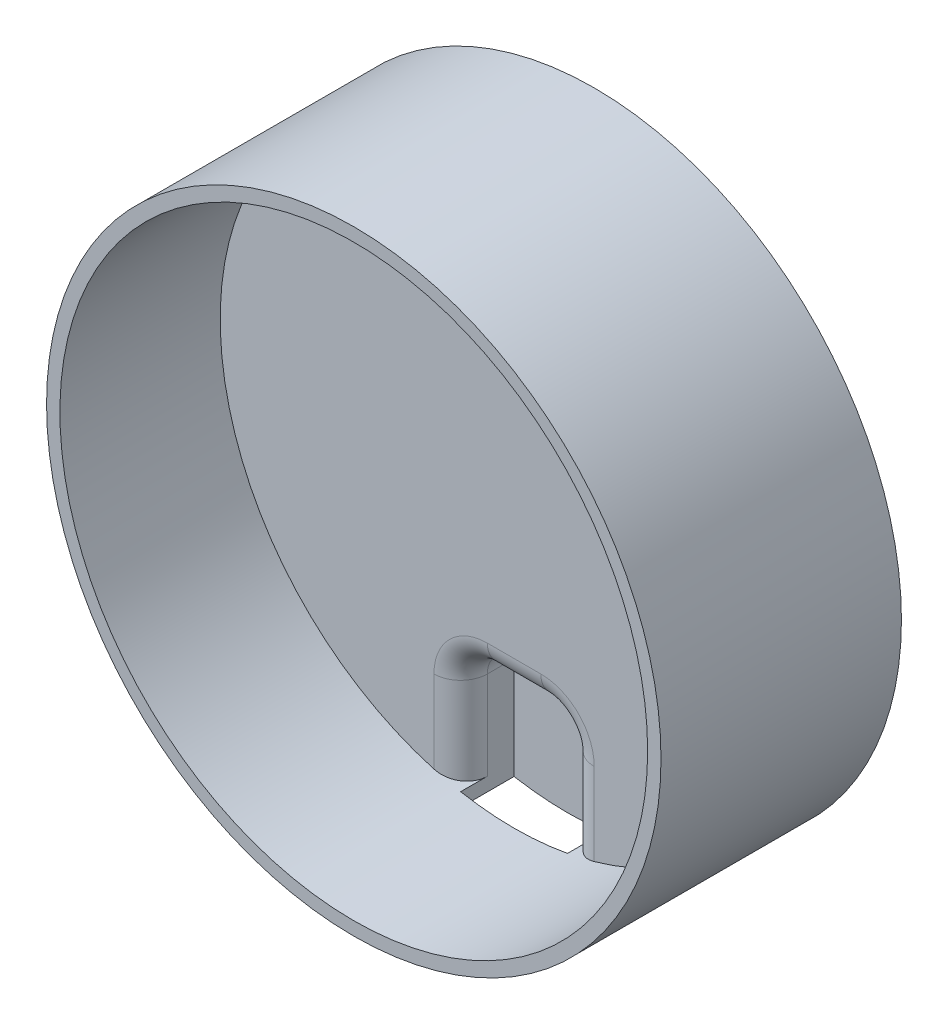
ISO-10303-21;
HEADER;
FILE_DESCRIPTION(('STEP AP214'),'2;1');
FILE_NAME('part.step','',(''),(''),'','','');
FILE_SCHEMA(('AUTOMOTIVE_DESIGN { 1 0 10303 214 1 1 1 1 }'));
ENDSEC;
DATA;
#1=APPLICATION_CONTEXT('core data for automotive mechanical design processes');
#2=APPLICATION_PROTOCOL_DEFINITION('international standard','automotive_design',2000,#1);
#3=PRODUCT_CONTEXT('',#1,'mechanical');
#4=PRODUCT('Part','Part','',(#3));
#5=PRODUCT_RELATED_PRODUCT_CATEGORY('part','',(#4));
#6=PRODUCT_DEFINITION_FORMATION('','',#4);
#7=PRODUCT_DEFINITION_CONTEXT('part definition',#1,'design');
#8=PRODUCT_DEFINITION('design','',#6,#7);
#9=PRODUCT_DEFINITION_SHAPE('','',#8);
#10=(LENGTH_UNIT() NAMED_UNIT(*) SI_UNIT(.MILLI.,.METRE.));
#11=(NAMED_UNIT(*) PLANE_ANGLE_UNIT() SI_UNIT($,.RADIAN.));
#12=(NAMED_UNIT(*) SI_UNIT($,.STERADIAN.) SOLID_ANGLE_UNIT());
#13=UNCERTAINTY_MEASURE_WITH_UNIT(LENGTH_MEASURE(1.E-05),#10,'distance_accuracy_value','');
#14=(GEOMETRIC_REPRESENTATION_CONTEXT(3) GLOBAL_UNCERTAINTY_ASSIGNED_CONTEXT((#13)) GLOBAL_UNIT_ASSIGNED_CONTEXT((#10,
#11,#12)) REPRESENTATION_CONTEXT('',''));
#15=CARTESIAN_POINT('',(0.,0.,0.));
#16=DIRECTION('',(0.,0.,1.));
#17=DIRECTION('',(1.,0.,0.));
#18=AXIS2_PLACEMENT_3D('',#15,#16,#17);
#19=CARTESIAN_POINT('',(-5.18423182009248,10.7360109289618,0.));
#20=DIRECTION('',(0.,0.,-1.));
#21=DIRECTION('',(-1.,0.,0.));
#22=AXIS2_PLACEMENT_3D('',#19,#20,#21);
#23=PLANE('',#22);
#24=CARTESIAN_POINT('',(-4.18423182009248,3.23601092896175,0.));
#25=DIRECTION('',(0.,0.,-1.));
#26=DIRECTION('',(-1.,0.,0.));
#27=AXIS2_PLACEMENT_3D('',#24,#25,#26);
#28=CIRCLE('',#27,2.);
#29=CARTESIAN_POINT('',(-2.18423182009248,3.23601092896176,0.));
#30=VERTEX_POINT('',#29);
#31=CARTESIAN_POINT('',(-4.18423182009248,5.23601092896175,0.));
#32=VERTEX_POINT('',#31);
#33=EDGE_CURVE('E194',#30,#32,#28,.F.);
#34=ORIENTED_EDGE('',*,*,#33,.F.);
#35=DIRECTION('',(0.,1.,0.));
#36=VECTOR('',#35,1.);
#37=CARTESIAN_POINT('',(-2.18423182009249,10.7360109289618,0.));
#38=LINE('',#37,#36);
#39=CARTESIAN_POINT('',(-2.18423182009248,0.153005684703396,0.));
#40=VERTEX_POINT('',#39);
#41=EDGE_CURVE('E208',#30,#40,#38,.F.);
#42=ORIENTED_EDGE('',*,*,#41,.T.);
#43=CARTESIAN_POINT('',(-5.18423182009248,10.7360109289618,0.));
#44=DIRECTION('',(0.,0.,1.));
#45=DIRECTION('',(1.,0.,0.));
#46=AXIS2_PLACEMENT_3D('',#43,#44,#45);
#47=CIRCLE('',#46,11.);
#48=CARTESIAN_POINT('',(-8.18423182009248,0.153005684703398,0.));
#49=VERTEX_POINT('',#48);
#50=EDGE_CURVE('E158',#40,#49,#47,.T.);
#51=ORIENTED_EDGE('',*,*,#50,.T.);
#52=DIRECTION('',(0.,-1.,0.));
#53=VECTOR('',#52,1.);
#54=CARTESIAN_POINT('',(-8.18423182009248,10.7360109289618,0.));
#55=LINE('',#54,#53);
#56=CARTESIAN_POINT('',(-8.18423182009248,3.23601092896175,0.));
#57=VERTEX_POINT('',#56);
#58=EDGE_CURVE('E205',#49,#57,#55,.F.);
#59=ORIENTED_EDGE('',*,*,#58,.T.);
#60=CARTESIAN_POINT('',(-6.18423182009248,3.23601092896175,0.));
#61=DIRECTION('',(0.,0.,-1.));
#62=DIRECTION('',(-1.,0.,0.));
#63=AXIS2_PLACEMENT_3D('',#60,#61,#62);
#64=CIRCLE('',#63,2.);
#65=CARTESIAN_POINT('',(-6.18423182009248,5.23601092896175,0.));
#66=VERTEX_POINT('',#65);
#67=EDGE_CURVE('E201',#66,#57,#64,.F.);
#68=ORIENTED_EDGE('',*,*,#67,.F.);
#69=DIRECTION('',(-1.,0.,0.));
#70=VECTOR('',#69,1.);
#71=CARTESIAN_POINT('',(-5.18423182009248,5.23601092896175,0.));
#72=LINE('',#71,#70);
#73=EDGE_CURVE('E198',#66,#32,#72,.F.);
#74=ORIENTED_EDGE('',*,*,#73,.T.);
#75=EDGE_LOOP('',(#34,#42,#51,#59,#68,#74));
#76=FACE_BOUND('',#75,.T.);
#77=ADVANCED_FACE('F47',(#76),#23,.F.);
#78=CARTESIAN_POINT('',(-5.18423182009248,10.7360109289618,6.));
#79=DIRECTION('',(0.,0.,1.));
#80=DIRECTION('',(1.,0.,0.));
#81=AXIS2_PLACEMENT_3D('',#78,#79,#80);
#82=PLANE('',#81);
#83=CARTESIAN_POINT('',(-5.18423182009248,10.7360109289618,6.));
#84=DIRECTION('',(0.,0.,1.));
#85=DIRECTION('',(1.,0.,0.));
#86=AXIS2_PLACEMENT_3D('',#83,#84,#85);
#87=CIRCLE('',#86,11.5);
#88=CARTESIAN_POINT('',(6.31576817990752,10.7360109289618,6.));
#89=VERTEX_POINT('',#88);
#90=EDGE_CURVE('E163',#89,#89,#87,.T.);
#91=ORIENTED_EDGE('',*,*,#90,.T.);
#92=EDGE_LOOP('',(#91));
#93=FACE_BOUND('',#92,.T.);
#94=CARTESIAN_POINT('',(-5.18423182009248,10.7360109289618,6.));
#95=DIRECTION('',(0.,0.,1.));
#96=DIRECTION('',(1.,0.,0.));
#97=AXIS2_PLACEMENT_3D('',#94,#95,#96);
#98=CIRCLE('',#97,11.);
#99=CARTESIAN_POINT('',(5.81576817990752,10.7360109289618,6.));
#100=VERTEX_POINT('',#99);
#101=EDGE_CURVE('E157',#100,#100,#98,.T.);
#102=ORIENTED_EDGE('',*,*,#101,.F.);
#103=EDGE_LOOP('',(#102));
#104=FACE_BOUND('',#103,.T.);
#105=ADVANCED_FACE('F253',(#93,#104),#82,.T.);
#106=CARTESIAN_POINT('',(-5.18423182009248,10.7360109289618,6.));
#107=DIRECTION('',(0.,0.,-1.));
#108=DIRECTION('',(-1.,0.,0.));
#109=AXIS2_PLACEMENT_3D('',#106,#107,#108);
#110=CYLINDRICAL_SURFACE('',#109,11.5);
#111=DIRECTION('',(0.,0.,-1.));
#112=VECTOR('',#111,1.);
#113=CARTESIAN_POINT('',(-3.18423182009248,-0.588740723944367,6.));
#114=LINE('',#113,#112);
#115=CARTESIAN_POINT('',(-3.18423182009248,-0.588740723944367,0.));
#116=VERTEX_POINT('',#115);
#117=CARTESIAN_POINT('',(-3.18423182009248,-0.588740723944367,-2.));
#118=VERTEX_POINT('',#117);
#119=EDGE_CURVE('E174',#116,#118,#114,.T.);
#120=ORIENTED_EDGE('',*,*,#119,.T.);
#121=CARTESIAN_POINT('',(-5.18423182009248,10.7360109289618,-2.));
#122=DIRECTION('',(0.,0.,-1.));
#123=DIRECTION('',(-1.,0.,0.));
#124=AXIS2_PLACEMENT_3D('',#121,#122,#123);
#125=CIRCLE('',#124,11.5);
#126=CARTESIAN_POINT('',(-7.18423182009248,-0.588740723944369,-2.));
#127=VERTEX_POINT('',#126);
#128=EDGE_CURVE('E181',#118,#127,#125,.T.);
#129=ORIENTED_EDGE('',*,*,#128,.T.);
#130=DIRECTION('',(0.,0.,-1.));
#131=VECTOR('',#130,1.);
#132=CARTESIAN_POINT('',(-7.18423182009248,-0.588740723944369,6.));
#133=LINE('',#132,#131);
#134=CARTESIAN_POINT('',(-7.18423182009248,-0.588740723944369,0.));
#135=VERTEX_POINT('',#134);
#136=EDGE_CURVE('E178',#127,#135,#133,.F.);
#137=ORIENTED_EDGE('',*,*,#136,.T.);
#138=CARTESIAN_POINT('',(-5.18423182009248,10.7360109289618,0.));
#139=DIRECTION('',(0.,0.,-1.));
#140=DIRECTION('',(-1.,0.,0.));
#141=AXIS2_PLACEMENT_3D('',#138,#139,#140);
#142=CIRCLE('',#141,11.5);
#143=EDGE_CURVE('E151',#116,#135,#142,.T.);
#144=ORIENTED_EDGE('',*,*,#143,.F.);
#145=EDGE_LOOP('',(#120,#129,#137,#144));
#146=FACE_BOUND('',#145,.T.);
#147=ORIENTED_EDGE('',*,*,#90,.F.);
#148=EDGE_LOOP('',(#147));
#149=FACE_BOUND('',#148,.T.);
#150=CARTESIAN_POINT('',(-5.18423182009248,10.7360109289618,-3.));
#151=DIRECTION('',(0.,0.,-1.));
#152=DIRECTION('',(-1.,0.,0.));
#153=AXIS2_PLACEMENT_3D('',#150,#151,#152);
#154=CIRCLE('',#153,11.5);
#155=CARTESIAN_POINT('',(-16.6842318200925,10.7360109289618,-3.));
#156=VERTEX_POINT('',#155);
#157=EDGE_CURVE('E166',#156,#156,#154,.T.);
#158=ORIENTED_EDGE('',*,*,#157,.F.);
#159=EDGE_LOOP('',(#158));
#160=FACE_BOUND('',#159,.T.);
#161=ADVANCED_FACE('F250',(#146,#149,#160),#110,.T.);
#162=CARTESIAN_POINT('',(-5.18423182009248,10.7360109289618,6.));
#163=DIRECTION('',(0.,0.,-1.));
#164=DIRECTION('',(-1.,0.,0.));
#165=AXIS2_PLACEMENT_3D('',#162,#163,#164);
#166=CYLINDRICAL_SURFACE('',#165,11.);
#167=ORIENTED_EDGE('',*,*,#101,.T.);
#168=EDGE_LOOP('',(#167));
#169=FACE_BOUND('',#168,.T.);
#170=CARTESIAN_POINT('',(-7.18423182009248,-0.0806428974302088,0.));
#171=VERTEX_POINT('',#170);
#172=CARTESIAN_POINT('',(-3.18423182009248,-0.0806428974302071,0.));
#173=VERTEX_POINT('',#172);
#174=EDGE_CURVE('E150',#171,#173,#47,.T.);
#175=ORIENTED_EDGE('',*,*,#174,.F.);
#176=DIRECTION('',(0.,0.,-1.));
#177=VECTOR('',#176,1.);
#178=CARTESIAN_POINT('',(-7.18423182009248,-0.0806428974302088,-1.));
#179=LINE('',#178,#177);
#180=CARTESIAN_POINT('',(-7.18423182009248,-0.0806428974302088,-1.));
#181=VERTEX_POINT('',#180);
#182=EDGE_CURVE('E134',#181,#171,#179,.F.);
#183=ORIENTED_EDGE('',*,*,#182,.F.);
#184=CARTESIAN_POINT('',(-7.18423182009248,-0.0806428974302088,-1.));
#185=CARTESIAN_POINT('',(-7.18423177463327,-0.0806422869424325,-0.972258752276593));
#186=CARTESIAN_POINT('',(-7.18538693667628,-0.0804293852593474,-0.944530858273163));
#187=CARTESIAN_POINT('',(-7.18999378875954,-0.0795762964044474,-0.8892749936896));
#188=CARTESIAN_POINT('',(-7.19344532728222,-0.0789361374235505,-0.861747010040287));
#189=CARTESIAN_POINT('',(-7.2072058701618,-0.0763740373864095,-0.77982460726582));
#190=CARTESIAN_POINT('',(-7.22092092773206,-0.0738104888622706,-0.72598143951789));
#191=CARTESIAN_POINT('',(-7.25701398947779,-0.0669473407041112,-0.621407534284094));
#192=CARTESIAN_POINT('',(-7.27939541061562,-0.0626470562833616,-0.570678033602038));
#193=CARTESIAN_POINT('',(-7.33212107287745,-0.0522832244348989,-0.47374010754615));
#194=CARTESIAN_POINT('',(-7.36246452548832,-0.0462198516067456,-0.427531235097446));
#195=CARTESIAN_POINT('',(-7.43033411692443,-0.0322863531029595,-0.340689609155465));
#196=CARTESIAN_POINT('',(-7.46789336142271,-0.0244078652313488,-0.300084099281275));
#197=CARTESIAN_POINT('',(-7.54895107837842,-0.00688527572085646,-0.225763419727203));
#198=CARTESIAN_POINT('',(-7.59245037967602,0.00275907237976829,-0.192049213260847));
#199=CARTESIAN_POINT('',(-7.68479494044306,0.0238935217597276,-0.131871037441532));
#200=CARTESIAN_POINT('',(-7.73371279402689,0.0354099857782793,-0.105527925513152));
#201=CARTESIAN_POINT('',(-7.8348921488052,0.0600234998016867,-0.0613801333439638));
#202=CARTESIAN_POINT('',(-7.88715355326666,0.0731205040892793,-0.0435752062094819));
#203=CARTESIAN_POINT('',(-7.98036500036044,0.0972446154346724,-0.0201303206303154));
#204=CARTESIAN_POINT('',(-8.0209202320516,0.10798386058537,-0.0125718057498728));
#205=CARTESIAN_POINT('',(-8.10241539239132,0.130068788386396,-0.00250697420107241));
#206=CARTESIAN_POINT('',(-8.1433545455798,0.141413403804901,7.95041071891822E-06));
#207=CARTESIAN_POINT('',(-8.18423182009248,0.153005684703397,0.));
#208=B_SPLINE_CURVE_WITH_KNOTS('',3,(#184,#185,#186,#187,#188,#189,#190,#191,#192,#193,#194,
#195,#196,#197,#198,#199,#200,#201,#202,#203,#204,#205,#206,#207),.UNSPECIFIED.,.F.,.F.,(4,2,2,
2,2,2,2,2,2,2,2,4),(0.,0.0831723927392125,0.166339298212691,0.332346450219146,0.498419122063063,
0.664475353242006,0.831312466044673,0.998172882137291,1.16762725501374,1.33707672758215,
1.46466866118571,1.59204264646731),.UNSPECIFIED.);
#209=EDGE_CURVE('E11',#181,#49,#208,.T.);
#210=ORIENTED_EDGE('',*,*,#209,.T.);
#211=ORIENTED_EDGE('',*,*,#50,.F.);
#212=CARTESIAN_POINT('',(-2.18423182009248,0.153005684703396,0.));
#213=CARTESIAN_POINT('',(-2.24100915306646,0.136891603268559,4.64075337397574E-05));
#214=CARTESIAN_POINT('',(-2.29794157643043,0.121265182873462,-0.00483417522478266));
#215=CARTESIAN_POINT('',(-2.41051093546785,0.0913052728027132,-0.0242757859651074));
#216=CARTESIAN_POINT('',(-2.46614712584722,0.0769725139649434,-0.0388422474654044));
#217=CARTESIAN_POINT('',(-2.57452176083388,0.0499186779136462,-0.077507008397882));
#218=CARTESIAN_POINT('',(-2.62725631924261,0.03719973371355,-0.101617752927257));
#219=CARTESIAN_POINT('',(-2.72804092862509,0.0136138773871811,-0.158796251475863));
#220=CARTESIAN_POINT('',(-2.77609412297181,0.00274571880341924,-0.191857938088128));
#221=CARTESIAN_POINT('',(-2.86484721431181,-0.0167782638590716,-0.265157123398469));
#222=CARTESIAN_POINT('',(-2.90569905623021,-0.0254819793470631,-0.305197853564687));
#223=CARTESIAN_POINT('',(-2.98013642451633,-0.0409744001956611,-0.391888988557135));
#224=CARTESIAN_POINT('',(-3.0137204979806,-0.0477627227313061,-0.43854071191156));
#225=CARTESIAN_POINT('',(-3.07177390268943,-0.0592833982455896,-0.535882781689624));
#226=CARTESIAN_POINT('',(-3.09644378761648,-0.0640614483175411,-0.586448370533961));
#227=CARTESIAN_POINT('',(-3.13697728950263,-0.0718185598383866,-0.691101791991747));
#228=CARTESIAN_POINT('',(-3.15284833329827,-0.0747991386657057,-0.745186610905423));
#229=CARTESIAN_POINT('',(-3.17077355747127,-0.0781478740798068,-0.833075281497483));
#230=CARTESIAN_POINT('',(-3.17581794223419,-0.0790846838452515,-0.866277340997182));
#231=CARTESIAN_POINT('',(-3.18254591004588,-0.080331222980995,-0.932981166717575));
#232=CARTESIAN_POINT('',(-3.18423455450417,-0.0806418967522687,-0.966482404904168));
#233=CARTESIAN_POINT('',(-3.18423182009248,-0.080642897430209,-1.));
#234=B_SPLINE_CURVE_WITH_KNOTS('',3,(#212,#213,#214,#215,#216,#217,#218,#219,#220,#221,#222,
#223,#224,#225,#226,#227,#228,#229,#230,#231,#232,#233),.UNSPECIFIED.,.F.,.F.,(4,2,2,2,2,2,2,2,
2,2,4),(0.,0.176881073997834,0.353861457344681,0.531073375296356,0.708165469397476,
0.880896351614881,1.0536617327213,1.2222543768895,1.39070449958403,1.49133315323502,
1.59180991474817),.UNSPECIFIED.);
#235=CARTESIAN_POINT('',(-3.18423182009248,-0.0806428974302089,-1.));
#236=VERTEX_POINT('',#235);
#237=EDGE_CURVE('E57',#40,#236,#234,.T.);
#238=ORIENTED_EDGE('',*,*,#237,.T.);
#239=DIRECTION('',(0.,0.,-1.));
#240=VECTOR('',#239,1.);
#241=CARTESIAN_POINT('',(-3.18423182009248,-0.0806428974302071,0.));
#242=LINE('',#241,#240);
#243=EDGE_CURVE('E65',#173,#236,#242,.T.);
#244=ORIENTED_EDGE('',*,*,#243,.F.);
#245=EDGE_LOOP('',(#175,#183,#210,#211,#238,#244));
#246=FACE_BOUND('',#245,.T.);
#247=ADVANCED_FACE('F155',(#169,#246),#166,.F.);
#248=CARTESIAN_POINT('',(-5.18423182009248,10.7360109289618,-3.));
#249=DIRECTION('',(0.,0.,-1.));
#250=DIRECTION('',(-1.,0.,0.));
#251=AXIS2_PLACEMENT_3D('',#248,#249,#250);
#252=PLANE('',#251);
#253=ORIENTED_EDGE('',*,*,#157,.T.);
#254=EDGE_LOOP('',(#253));
#255=FACE_BOUND('',#254,.T.);
#256=ADVANCED_FACE('F249',(#255),#252,.T.);
#257=CARTESIAN_POINT('',(-7.18423182009248,-0.763989071038246,-2.));
#258=DIRECTION('',(-1.,0.,0.));
#259=DIRECTION('',(0.,0.,1.));
#260=AXIS2_PLACEMENT_3D('',#257,#258,#259);
#261=PLANE('',#260);
#262=DIRECTION('',(0.,-1.,0.));
#263=VECTOR('',#262,1.);
#264=CARTESIAN_POINT('',(-7.18423182009248,-0.763989071038246,-1.));
#265=LINE('',#264,#263);
#266=CARTESIAN_POINT('',(-7.18423182009248,3.23601092896175,-1.));
#267=VERTEX_POINT('',#266);
#268=EDGE_CURVE('E141',#267,#181,#265,.T.);
#269=ORIENTED_EDGE('',*,*,#268,.T.);
#270=ORIENTED_EDGE('',*,*,#182,.T.);
#271=DIRECTION('',(0.,-1.,0.));
#272=VECTOR('',#271,1.);
#273=CARTESIAN_POINT('',(-7.18423182009248,-0.763989071038246,0.));
#274=LINE('',#273,#272);
#275=EDGE_CURVE('E138',#171,#135,#274,.T.);
#276=ORIENTED_EDGE('',*,*,#275,.T.);
#277=ORIENTED_EDGE('',*,*,#136,.F.);
#278=DIRECTION('',(0.,-1.,0.));
#279=VECTOR('',#278,1.);
#280=CARTESIAN_POINT('',(-7.18423182009248,-0.763989071038246,-2.));
#281=LINE('',#280,#279);
#282=CARTESIAN_POINT('',(-7.18423182009248,3.23601092896175,-2.));
#283=VERTEX_POINT('',#282);
#284=EDGE_CURVE('E318',#283,#127,#281,.T.);
#285=ORIENTED_EDGE('',*,*,#284,.F.);
#286=DIRECTION('',(0.,0.,1.));
#287=VECTOR('',#286,1.);
#288=CARTESIAN_POINT('',(-7.18423182009248,3.23601092896175,0.));
#289=LINE('',#288,#287);
#290=EDGE_CURVE('E211',#283,#267,#289,.T.);
#291=ORIENTED_EDGE('',*,*,#290,.T.);
#292=EDGE_LOOP('',(#269,#270,#276,#277,#285,#291));
#293=FACE_BOUND('',#292,.T.);
#294=ADVANCED_FACE('F136',(#293),#261,.F.);
#295=CARTESIAN_POINT('',(-3.18423182009248,4.23601092896175,-2.));
#296=DIRECTION('',(1.,0.,0.));
#297=DIRECTION('',(0.,1.,0.));
#298=AXIS2_PLACEMENT_3D('',#295,#296,#297);
#299=PLANE('',#298);
#300=DIRECTION('',(0.,1.,0.));
#301=VECTOR('',#300,1.);
#302=CARTESIAN_POINT('',(-3.18423182009248,4.23601092896175,0.));
#303=LINE('',#302,#301);
#304=EDGE_CURVE('E153',#116,#173,#303,.T.);
#305=ORIENTED_EDGE('',*,*,#304,.T.);
#306=ORIENTED_EDGE('',*,*,#243,.T.);
#307=DIRECTION('',(0.,1.,0.));
#308=VECTOR('',#307,1.);
#309=CARTESIAN_POINT('',(-3.18423182009248,4.23601092896175,-1.));
#310=LINE('',#309,#308);
#311=CARTESIAN_POINT('',(-3.18423182009248,3.23601092896176,-1.));
#312=VERTEX_POINT('',#311);
#313=EDGE_CURVE('E188',#236,#312,#310,.T.);
#314=ORIENTED_EDGE('',*,*,#313,.T.);
#315=DIRECTION('',(0.,0.,1.));
#316=VECTOR('',#315,1.);
#317=CARTESIAN_POINT('',(-3.18423182009248,3.23601092896176,-2.));
#318=LINE('',#317,#316);
#319=CARTESIAN_POINT('',(-3.18423182009248,3.23601092896176,-2.));
#320=VERTEX_POINT('',#319);
#321=EDGE_CURVE('E185',#312,#320,#318,.F.);
#322=ORIENTED_EDGE('',*,*,#321,.T.);
#323=DIRECTION('',(0.,1.,0.));
#324=VECTOR('',#323,1.);
#325=CARTESIAN_POINT('',(-3.18423182009248,4.23601092896175,-2.));
#326=LINE('',#325,#324);
#327=EDGE_CURVE('E321',#118,#320,#326,.T.);
#328=ORIENTED_EDGE('',*,*,#327,.F.);
#329=ORIENTED_EDGE('',*,*,#119,.F.);
#330=EDGE_LOOP('',(#305,#306,#314,#322,#328,#329));
#331=FACE_BOUND('',#330,.T.);
#332=ADVANCED_FACE('F315',(#331),#299,.F.);
#333=CARTESIAN_POINT('',(0.,0.,-2.));
#334=DIRECTION('',(0.,0.,-1.));
#335=DIRECTION('',(-1.,0.,0.));
#336=AXIS2_PLACEMENT_3D('',#333,#334,#335);
#337=PLANE('',#336);
#338=ORIENTED_EDGE('',*,*,#327,.T.);
#339=CARTESIAN_POINT('',(-4.18423182009248,3.23601092896175,-2.));
#340=DIRECTION('',(0.,0.,-1.));
#341=DIRECTION('',(-1.,0.,0.));
#342=AXIS2_PLACEMENT_3D('',#339,#340,#341);
#343=CIRCLE('',#342,1.);
#344=CARTESIAN_POINT('',(-4.18423182009248,4.23601092896175,-2.));
#345=VERTEX_POINT('',#344);
#346=EDGE_CURVE('E226',#320,#345,#343,.F.);
#347=ORIENTED_EDGE('',*,*,#346,.T.);
#348=DIRECTION('',(-1.,0.,0.));
#349=VECTOR('',#348,1.);
#350=CARTESIAN_POINT('',(-7.18423182009248,4.23601092896175,-2.));
#351=LINE('',#350,#349);
#352=CARTESIAN_POINT('',(-6.18423182009248,4.23601092896175,-2.));
#353=VERTEX_POINT('',#352);
#354=EDGE_CURVE('E326',#345,#353,#351,.T.);
#355=ORIENTED_EDGE('',*,*,#354,.T.);
#356=CARTESIAN_POINT('',(-6.18423182009248,3.23601092896175,-2.));
#357=DIRECTION('',(0.,0.,-1.));
#358=DIRECTION('',(-1.,0.,0.));
#359=AXIS2_PLACEMENT_3D('',#356,#357,#358);
#360=CIRCLE('',#359,1.);
#361=EDGE_CURVE('E223',#353,#283,#360,.F.);
#362=ORIENTED_EDGE('',*,*,#361,.T.);
#363=ORIENTED_EDGE('',*,*,#284,.T.);
#364=ORIENTED_EDGE('',*,*,#128,.F.);
#365=EDGE_LOOP('',(#338,#347,#355,#362,#363,#364));
#366=FACE_BOUND('',#365,.T.);
#367=ADVANCED_FACE('F335',(#366),#337,.F.);
#368=CARTESIAN_POINT('',(0.,0.,0.));
#369=DIRECTION('',(0.,0.,-1.));
#370=DIRECTION('',(-1.,0.,0.));
#371=AXIS2_PLACEMENT_3D('',#368,#369,#370);
#372=PLANE('',#371);
#373=ORIENTED_EDGE('',*,*,#174,.T.);
#374=ORIENTED_EDGE('',*,*,#304,.F.);
#375=ORIENTED_EDGE('',*,*,#143,.T.);
#376=ORIENTED_EDGE('',*,*,#275,.F.);
#377=EDGE_LOOP('',(#373,#374,#375,#376));
#378=FACE_BOUND('',#377,.T.);
#379=ADVANCED_FACE('F148',(#378),#372,.T.);
#380=CARTESIAN_POINT('',(-7.18423182009248,4.23601092896175,-2.));
#381=DIRECTION('',(0.,1.,0.));
#382=DIRECTION('',(-1.,0.,0.));
#383=AXIS2_PLACEMENT_3D('',#380,#381,#382);
#384=PLANE('',#383);
#385=ORIENTED_EDGE('',*,*,#354,.F.);
#386=DIRECTION('',(0.,0.,1.));
#387=VECTOR('',#386,1.);
#388=CARTESIAN_POINT('',(-4.18423182009248,4.23601092896175,0.));
#389=LINE('',#388,#387);
#390=CARTESIAN_POINT('',(-4.18423182009248,4.23601092896175,-1.));
#391=VERTEX_POINT('',#390);
#392=EDGE_CURVE('E73',#345,#391,#389,.T.);
#393=ORIENTED_EDGE('',*,*,#392,.T.);
#394=DIRECTION('',(-1.,0.,0.));
#395=VECTOR('',#394,1.);
#396=CARTESIAN_POINT('',(-7.18423182009248,4.23601092896175,-1.));
#397=LINE('',#396,#395);
#398=CARTESIAN_POINT('',(-6.18423182009248,4.23601092896175,-1.));
#399=VERTEX_POINT('',#398);
#400=EDGE_CURVE('E218',#391,#399,#397,.T.);
#401=ORIENTED_EDGE('',*,*,#400,.T.);
#402=DIRECTION('',(0.,0.,1.));
#403=VECTOR('',#402,1.);
#404=CARTESIAN_POINT('',(-6.18423182009248,4.23601092896175,-2.));
#405=LINE('',#404,#403);
#406=EDGE_CURVE('E144',#399,#353,#405,.F.);
#407=ORIENTED_EDGE('',*,*,#406,.T.);
#408=EDGE_LOOP('',(#385,#393,#401,#407));
#409=FACE_BOUND('',#408,.T.);
#410=ADVANCED_FACE('F337',(#409),#384,.F.);
#411=CARTESIAN_POINT('',(-6.18423182009248,3.23601092896175,-2.));
#412=DIRECTION('',(0.,0.,-1.));
#413=DIRECTION('',(-1.,0.,0.));
#414=AXIS2_PLACEMENT_3D('',#411,#412,#413);
#415=CYLINDRICAL_SURFACE('',#414,1.);
#416=ORIENTED_EDGE('',*,*,#361,.F.);
#417=ORIENTED_EDGE('',*,*,#406,.F.);
#418=CARTESIAN_POINT('',(-6.18423182009248,3.23601092896175,-1.));
#419=DIRECTION('',(0.,0.,-1.));
#420=DIRECTION('',(-1.,0.,0.));
#421=AXIS2_PLACEMENT_3D('',#418,#419,#420);
#422=CIRCLE('',#421,1.);
#423=EDGE_CURVE('E51',#267,#399,#422,.T.);
#424=ORIENTED_EDGE('',*,*,#423,.F.);
#425=ORIENTED_EDGE('',*,*,#290,.F.);
#426=EDGE_LOOP('',(#416,#417,#424,#425));
#427=FACE_BOUND('',#426,.T.);
#428=ADVANCED_FACE('F49',(#427),#415,.F.);
#429=CARTESIAN_POINT('',(-8.18423182009248,-0.763989071038246,-1.));
#430=DIRECTION('',(0.,-1.,0.));
#431=DIRECTION('',(0.,0.,-1.));
#432=AXIS2_PLACEMENT_3D('',#429,#430,#431);
#433=CYLINDRICAL_SURFACE('',#432,1.);
#434=ORIENTED_EDGE('',*,*,#209,.F.);
#435=ORIENTED_EDGE('',*,*,#268,.F.);
#436=CARTESIAN_POINT('',(-8.18423182009248,3.23601092896175,-1.));
#437=DIRECTION('',(0.,1.,0.));
#438=DIRECTION('',(0.,0.,1.));
#439=AXIS2_PLACEMENT_3D('',#436,#437,#438);
#440=CIRCLE('',#439,1.);
#441=EDGE_CURVE('E294',#57,#267,#440,.T.);
#442=ORIENTED_EDGE('',*,*,#441,.F.);
#443=ORIENTED_EDGE('',*,*,#58,.F.);
#444=EDGE_LOOP('',(#434,#435,#442,#443));
#445=FACE_BOUND('',#444,.T.);
#446=ADVANCED_FACE('F344',(#445),#433,.T.);
#447=CARTESIAN_POINT('',(-6.18423182009248,3.23601092896175,-1.));
#448=DIRECTION('',(0.,0.,-1.));
#449=DIRECTION('',(-1.,0.,0.));
#450=AXIS2_PLACEMENT_3D('',#447,#448,#449);
#451=TOROIDAL_SURFACE('',#450,2.,1.);
#452=ORIENTED_EDGE('',*,*,#441,.T.);
#453=ORIENTED_EDGE('',*,*,#423,.T.);
#454=CARTESIAN_POINT('',(-6.18423182009248,5.23601092896175,-1.));
#455=DIRECTION('',(-1.,0.,0.));
#456=DIRECTION('',(0.,0.,1.));
#457=AXIS2_PLACEMENT_3D('',#454,#455,#456);
#458=CIRCLE('',#457,1.);
#459=EDGE_CURVE('E291',#66,#399,#458,.F.);
#460=ORIENTED_EDGE('',*,*,#459,.F.);
#461=ORIENTED_EDGE('',*,*,#67,.T.);
#462=EDGE_LOOP('',(#452,#453,#460,#461));
#463=FACE_BOUND('',#462,.T.);
#464=ADVANCED_FACE('F303',(#463),#451,.T.);
#465=CARTESIAN_POINT('',(-4.18423182009248,3.23601092896175,-2.));
#466=DIRECTION('',(0.,0.,-1.));
#467=DIRECTION('',(-1.,0.,0.));
#468=AXIS2_PLACEMENT_3D('',#465,#466,#467);
#469=CYLINDRICAL_SURFACE('',#468,1.);
#470=ORIENTED_EDGE('',*,*,#346,.F.);
#471=ORIENTED_EDGE('',*,*,#321,.F.);
#472=CARTESIAN_POINT('',(-4.18423182009248,3.23601092896175,-1.));
#473=DIRECTION('',(0.,0.,-1.));
#474=DIRECTION('',(-1.,0.,0.));
#475=AXIS2_PLACEMENT_3D('',#472,#473,#474);
#476=CIRCLE('',#475,1.);
#477=EDGE_CURVE('E282',#391,#312,#476,.T.);
#478=ORIENTED_EDGE('',*,*,#477,.F.);
#479=ORIENTED_EDGE('',*,*,#392,.F.);
#480=EDGE_LOOP('',(#470,#471,#478,#479));
#481=FACE_BOUND('',#480,.T.);
#482=ADVANCED_FACE('F311',(#481),#469,.F.);
#483=CARTESIAN_POINT('',(-7.18423182009248,5.23601092896175,-1.));
#484=DIRECTION('',(-1.,0.,0.));
#485=DIRECTION('',(0.,-1.,0.));
#486=AXIS2_PLACEMENT_3D('',#483,#484,#485);
#487=CYLINDRICAL_SURFACE('',#486,1.);
#488=ORIENTED_EDGE('',*,*,#459,.T.);
#489=ORIENTED_EDGE('',*,*,#400,.F.);
#490=CARTESIAN_POINT('',(-4.18423182009248,5.23601092896175,-1.));
#491=DIRECTION('',(1.,0.,0.));
#492=DIRECTION('',(0.,0.,-1.));
#493=AXIS2_PLACEMENT_3D('',#490,#491,#492);
#494=CIRCLE('',#493,1.);
#495=EDGE_CURVE('E285',#32,#391,#494,.T.);
#496=ORIENTED_EDGE('',*,*,#495,.F.);
#497=ORIENTED_EDGE('',*,*,#73,.F.);
#498=EDGE_LOOP('',(#488,#489,#496,#497));
#499=FACE_BOUND('',#498,.T.);
#500=ADVANCED_FACE('F308',(#499),#487,.T.);
#501=CARTESIAN_POINT('',(-4.18423182009248,3.23601092896175,-1.));
#502=DIRECTION('',(0.,0.,-1.));
#503=DIRECTION('',(-1.,0.,0.));
#504=AXIS2_PLACEMENT_3D('',#501,#502,#503);
#505=TOROIDAL_SURFACE('',#504,2.,1.);
#506=ORIENTED_EDGE('',*,*,#495,.T.);
#507=ORIENTED_EDGE('',*,*,#477,.T.);
#508=CARTESIAN_POINT('',(-2.18423182009248,3.23601092896176,-1.));
#509=DIRECTION('',(0.,1.,0.));
#510=DIRECTION('',(-1.,0.,0.));
#511=AXIS2_PLACEMENT_3D('',#508,#509,#510);
#512=CIRCLE('',#511,1.);
#513=EDGE_CURVE('E278',#30,#312,#512,.F.);
#514=ORIENTED_EDGE('',*,*,#513,.F.);
#515=ORIENTED_EDGE('',*,*,#33,.T.);
#516=EDGE_LOOP('',(#506,#507,#514,#515));
#517=FACE_BOUND('',#516,.T.);
#518=ADVANCED_FACE('F280',(#517),#505,.T.);
#519=CARTESIAN_POINT('',(-2.18423182009248,4.23601092896176,-1.));
#520=DIRECTION('',(0.,1.,0.));
#521=DIRECTION('',(-1.,0.,0.));
#522=AXIS2_PLACEMENT_3D('',#519,#520,#521);
#523=CYLINDRICAL_SURFACE('',#522,1.);
#524=ORIENTED_EDGE('',*,*,#237,.F.);
#525=ORIENTED_EDGE('',*,*,#41,.F.);
#526=ORIENTED_EDGE('',*,*,#513,.T.);
#527=ORIENTED_EDGE('',*,*,#313,.F.);
#528=EDGE_LOOP('',(#524,#525,#526,#527));
#529=FACE_BOUND('',#528,.T.);
#530=ADVANCED_FACE('F241',(#529),#523,.T.);
#531=CLOSED_SHELL('',(#77,#105,#161,#247,#256,#294,#332,#367,#379,#410,#428,#446,#464,#482,#500,
#518,#530));
#532=MANIFOLD_SOLID_BREP('B2',#531);
#533=ADVANCED_BREP_SHAPE_REPRESENTATION('',(#18,#532),#14);
#534=SHAPE_DEFINITION_REPRESENTATION(#9,#533);
ENDSEC;
END-ISO-10303-21;
